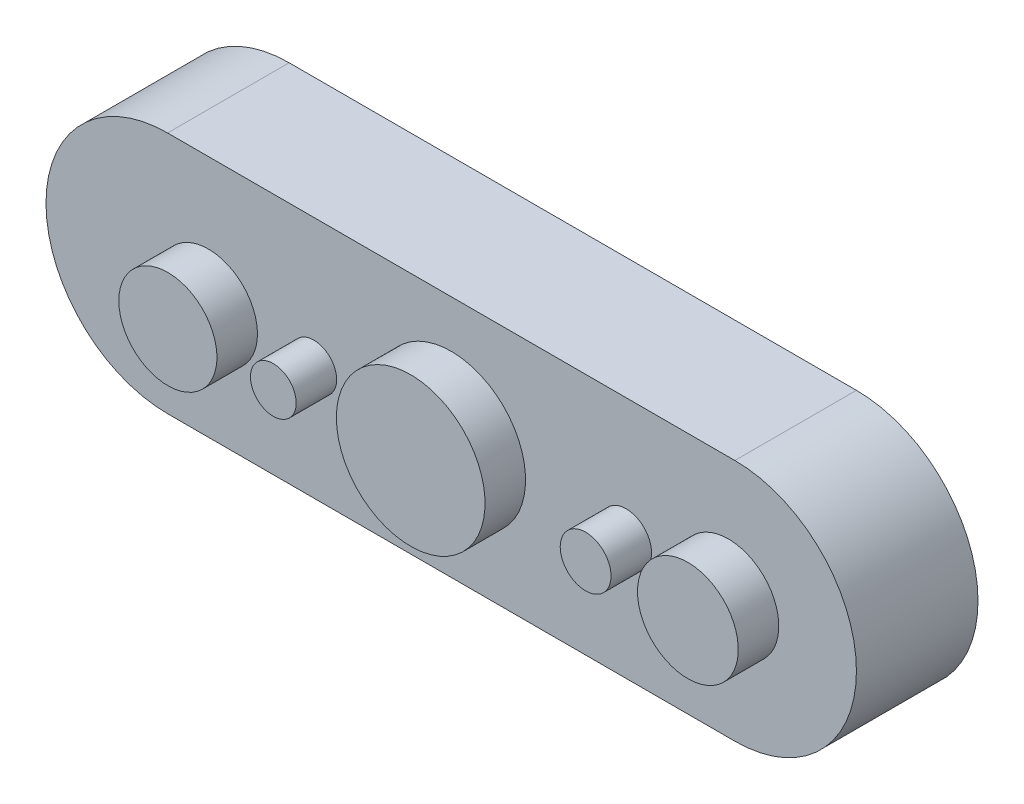
ISO-10303-21;
HEADER;
FILE_DESCRIPTION(('STEP AP214'),'2;1');
FILE_NAME('part.step','',(''),(''),'','','');
FILE_SCHEMA(('AUTOMOTIVE_DESIGN { 1 0 10303 214 1 1 1 1 }'));
ENDSEC;
DATA;
#1=APPLICATION_CONTEXT('core data for automotive mechanical design processes');
#2=APPLICATION_PROTOCOL_DEFINITION('international standard','automotive_design',2000,#1);
#3=PRODUCT_CONTEXT('',#1,'mechanical');
#4=PRODUCT('Part','Part','',(#3));
#5=PRODUCT_RELATED_PRODUCT_CATEGORY('part','',(#4));
#6=PRODUCT_DEFINITION_FORMATION('','',#4);
#7=PRODUCT_DEFINITION_CONTEXT('part definition',#1,'design');
#8=PRODUCT_DEFINITION('design','',#6,#7);
#9=PRODUCT_DEFINITION_SHAPE('','',#8);
#10=(LENGTH_UNIT() NAMED_UNIT(*) SI_UNIT(.MILLI.,.METRE.));
#11=(NAMED_UNIT(*) PLANE_ANGLE_UNIT() SI_UNIT($,.RADIAN.));
#12=(NAMED_UNIT(*) SI_UNIT($,.STERADIAN.) SOLID_ANGLE_UNIT());
#13=UNCERTAINTY_MEASURE_WITH_UNIT(LENGTH_MEASURE(1.E-05),#10,'distance_accuracy_value','');
#14=(GEOMETRIC_REPRESENTATION_CONTEXT(3) GLOBAL_UNCERTAINTY_ASSIGNED_CONTEXT((#13)) GLOBAL_UNIT_ASSIGNED_CONTEXT((#10,
#11,#12)) REPRESENTATION_CONTEXT('',''));
#15=CARTESIAN_POINT('',(0.,0.,0.));
#16=DIRECTION('',(0.,0.,1.));
#17=DIRECTION('',(1.,0.,0.));
#18=AXIS2_PLACEMENT_3D('',#15,#16,#17);
#19=CARTESIAN_POINT('',(-3.5,0.,1.5));
#20=DIRECTION('',(0.,0.,-1.));
#21=DIRECTION('',(-1.,0.,0.));
#22=AXIS2_PLACEMENT_3D('',#19,#20,#21);
#23=CYLINDRICAL_SURFACE('',#22,1.5);
#24=CARTESIAN_POINT('',(-3.5,0.,0.));
#25=DIRECTION('',(0.,0.,-1.));
#26=DIRECTION('',(-1.,0.,0.));
#27=AXIS2_PLACEMENT_3D('',#24,#25,#26);
#28=CIRCLE('',#27,1.5);
#29=CARTESIAN_POINT('',(-3.5,-1.5,0.));
#30=VERTEX_POINT('',#29);
#31=CARTESIAN_POINT('',(-3.5,1.5,0.));
#32=VERTEX_POINT('',#31);
#33=EDGE_CURVE('E101',#30,#32,#28,.T.);
#34=ORIENTED_EDGE('',*,*,#33,.F.);
#35=DIRECTION('',(0.,0.,-1.));
#36=VECTOR('',#35,1.);
#37=CARTESIAN_POINT('',(-3.5,-1.5,1.5));
#38=LINE('',#37,#36);
#39=CARTESIAN_POINT('',(-3.5,-1.5,1.5));
#40=VERTEX_POINT('',#39);
#41=EDGE_CURVE('E11',#40,#30,#38,.T.);
#42=ORIENTED_EDGE('',*,*,#41,.F.);
#43=CARTESIAN_POINT('',(-3.5,0.,1.5));
#44=DIRECTION('',(0.,0.,-1.));
#45=DIRECTION('',(-1.,0.,0.));
#46=AXIS2_PLACEMENT_3D('',#43,#44,#45);
#47=CIRCLE('',#46,1.5);
#48=CARTESIAN_POINT('',(-3.5,1.5,1.5));
#49=VERTEX_POINT('',#48);
#50=EDGE_CURVE('E94',#40,#49,#47,.T.);
#51=ORIENTED_EDGE('',*,*,#50,.T.);
#52=DIRECTION('',(0.,0.,-1.));
#53=VECTOR('',#52,1.);
#54=CARTESIAN_POINT('',(-3.5,1.5,1.5));
#55=LINE('',#54,#53);
#56=EDGE_CURVE('E39',#49,#32,#55,.T.);
#57=ORIENTED_EDGE('',*,*,#56,.T.);
#58=EDGE_LOOP('',(#34,#42,#51,#57));
#59=FACE_BOUND('',#58,.T.);
#60=ADVANCED_FACE('F36',(#59),#23,.T.);
#61=CARTESIAN_POINT('',(3.5,-1.5,1.5));
#62=DIRECTION('',(0.,-1.,0.));
#63=DIRECTION('',(0.,0.,-1.));
#64=AXIS2_PLACEMENT_3D('',#61,#62,#63);
#65=PLANE('',#64);
#66=DIRECTION('',(-1.,0.,0.));
#67=VECTOR('',#66,1.);
#68=CARTESIAN_POINT('',(3.5,-1.5,0.));
#69=LINE('',#68,#67);
#70=CARTESIAN_POINT('',(3.5,-1.5,0.));
#71=VERTEX_POINT('',#70);
#72=EDGE_CURVE('E96',#71,#30,#69,.T.);
#73=ORIENTED_EDGE('',*,*,#72,.F.);
#74=DIRECTION('',(0.,0.,-1.));
#75=VECTOR('',#74,1.);
#76=CARTESIAN_POINT('',(3.5,-1.5,1.5));
#77=LINE('',#76,#75);
#78=CARTESIAN_POINT('',(3.5,-1.5,1.5));
#79=VERTEX_POINT('',#78);
#80=EDGE_CURVE('E45',#79,#71,#77,.T.);
#81=ORIENTED_EDGE('',*,*,#80,.F.);
#82=DIRECTION('',(-1.,0.,0.));
#83=VECTOR('',#82,1.);
#84=CARTESIAN_POINT('',(3.5,-1.5,1.5));
#85=LINE('',#84,#83);
#86=EDGE_CURVE('E91',#79,#40,#85,.T.);
#87=ORIENTED_EDGE('',*,*,#86,.T.);
#88=ORIENTED_EDGE('',*,*,#41,.T.);
#89=EDGE_LOOP('',(#73,#81,#87,#88));
#90=FACE_BOUND('',#89,.T.);
#91=ADVANCED_FACE('F112',(#90),#65,.T.);
#92=CARTESIAN_POINT('',(3.5,0.,1.5));
#93=DIRECTION('',(0.,0.,-1.));
#94=DIRECTION('',(-1.,0.,0.));
#95=AXIS2_PLACEMENT_3D('',#92,#93,#94);
#96=CYLINDRICAL_SURFACE('',#95,1.5);
#97=CARTESIAN_POINT('',(3.5,0.,0.));
#98=DIRECTION('',(0.,0.,-1.));
#99=DIRECTION('',(-1.,0.,0.));
#100=AXIS2_PLACEMENT_3D('',#97,#98,#99);
#101=CIRCLE('',#100,1.5);
#102=CARTESIAN_POINT('',(3.5,1.5,0.));
#103=VERTEX_POINT('',#102);
#104=EDGE_CURVE('E86',#103,#71,#101,.T.);
#105=ORIENTED_EDGE('',*,*,#104,.F.);
#106=DIRECTION('',(0.,0.,-1.));
#107=VECTOR('',#106,1.);
#108=CARTESIAN_POINT('',(3.5,1.5,1.5));
#109=LINE('',#108,#107);
#110=CARTESIAN_POINT('',(3.5,1.5,1.5));
#111=VERTEX_POINT('',#110);
#112=EDGE_CURVE('E81',#111,#103,#109,.T.);
#113=ORIENTED_EDGE('',*,*,#112,.F.);
#114=CARTESIAN_POINT('',(3.5,0.,1.5));
#115=DIRECTION('',(0.,0.,-1.));
#116=DIRECTION('',(-1.,0.,0.));
#117=AXIS2_PLACEMENT_3D('',#114,#115,#116);
#118=CIRCLE('',#117,1.5);
#119=EDGE_CURVE('E84',#111,#79,#118,.T.);
#120=ORIENTED_EDGE('',*,*,#119,.T.);
#121=ORIENTED_EDGE('',*,*,#80,.T.);
#122=EDGE_LOOP('',(#105,#113,#120,#121));
#123=FACE_BOUND('',#122,.T.);
#124=ADVANCED_FACE('F83',(#123),#96,.T.);
#125=CARTESIAN_POINT('',(-3.5,1.5,1.5));
#126=DIRECTION('',(0.,1.,0.));
#127=DIRECTION('',(0.,0.,1.));
#128=AXIS2_PLACEMENT_3D('',#125,#126,#127);
#129=PLANE('',#128);
#130=DIRECTION('',(1.,0.,0.));
#131=VECTOR('',#130,1.);
#132=CARTESIAN_POINT('',(-3.5,1.5,0.));
#133=LINE('',#132,#131);
#134=EDGE_CURVE('E104',#32,#103,#133,.T.);
#135=ORIENTED_EDGE('',*,*,#134,.F.);
#136=ORIENTED_EDGE('',*,*,#56,.F.);
#137=DIRECTION('',(1.,0.,0.));
#138=VECTOR('',#137,1.);
#139=CARTESIAN_POINT('',(-3.5,1.5,1.5));
#140=LINE('',#139,#138);
#141=EDGE_CURVE('E90',#49,#111,#140,.T.);
#142=ORIENTED_EDGE('',*,*,#141,.T.);
#143=ORIENTED_EDGE('',*,*,#112,.T.);
#144=EDGE_LOOP('',(#135,#136,#142,#143));
#145=FACE_BOUND('',#144,.T.);
#146=ADVANCED_FACE('F93',(#145),#129,.T.);
#147=CARTESIAN_POINT('',(-3.5,0.,1.5));
#148=DIRECTION('',(0.,0.,-1.));
#149=DIRECTION('',(-1.,0.,0.));
#150=AXIS2_PLACEMENT_3D('',#147,#148,#149);
#151=PLANE('',#150);
#152=CARTESIAN_POINT('',(-2.99626852455027,-0.0936333913921916,1.5));
#153=DIRECTION('',(0.,0.,-1.));
#154=DIRECTION('',(-1.,0.,0.));
#155=AXIS2_PLACEMENT_3D('',#152,#153,#154);
#156=CIRCLE('',#155,0.605170603250103);
#157=CARTESIAN_POINT('',(-3.60143912780038,-0.0936333913921916,1.5));
#158=VERTEX_POINT('',#157);
#159=EDGE_CURVE('E178',#158,#158,#156,.T.);
#160=ORIENTED_EDGE('',*,*,#159,.T.);
#161=EDGE_LOOP('',(#160));
#162=FACE_BOUND('',#161,.T.);
#163=CARTESIAN_POINT('',(-1.69525719152187,-0.0936333913921916,1.5));
#164=DIRECTION('',(0.,0.,-1.));
#165=DIRECTION('',(-1.,0.,0.));
#166=AXIS2_PLACEMENT_3D('',#163,#164,#165);
#167=CIRCLE('',#166,0.282237082842353);
#168=CARTESIAN_POINT('',(-1.97749427436422,-0.0936333913921916,1.5));
#169=VERTEX_POINT('',#168);
#170=EDGE_CURVE('E177',#169,#169,#167,.T.);
#171=ORIENTED_EDGE('',*,*,#170,.T.);
#172=EDGE_LOOP('',(#171));
#173=FACE_BOUND('',#172,.T.);
#174=CARTESIAN_POINT('',(0.,0.,1.5));
#175=DIRECTION('',(0.,0.,-1.));
#176=DIRECTION('',(-1.,0.,0.));
#177=AXIS2_PLACEMENT_3D('',#174,#175,#176);
#178=CIRCLE('',#177,0.917270519237656);
#179=CARTESIAN_POINT('',(-0.917270519237656,0.,1.5));
#180=VERTEX_POINT('',#179);
#181=EDGE_CURVE('E187',#180,#180,#178,.T.);
#182=ORIENTED_EDGE('',*,*,#181,.T.);
#183=EDGE_LOOP('',(#182));
#184=FACE_BOUND('',#183,.T.);
#185=CARTESIAN_POINT('',(2.15849607525168,0.,1.5));
#186=DIRECTION('',(0.,0.,-1.));
#187=DIRECTION('',(-1.,0.,0.));
#188=AXIS2_PLACEMENT_3D('',#185,#186,#187);
#189=CIRCLE('',#188,0.313581939004538);
#190=CARTESIAN_POINT('',(1.84491413624714,0.,1.5));
#191=VERTEX_POINT('',#190);
#192=EDGE_CURVE('E193',#191,#191,#189,.T.);
#193=ORIENTED_EDGE('',*,*,#192,.T.);
#194=EDGE_LOOP('',(#193));
#195=FACE_BOUND('',#194,.T.);
#196=CARTESIAN_POINT('',(3.42008282243074,0.,1.5));
#197=DIRECTION('',(0.,0.,-1.));
#198=DIRECTION('',(-1.,0.,0.));
#199=AXIS2_PLACEMENT_3D('',#196,#197,#198);
#200=CIRCLE('',#199,0.621894725347653);
#201=CARTESIAN_POINT('',(2.79818809708309,0.,1.5));
#202=VERTEX_POINT('',#201);
#203=EDGE_CURVE('E199',#202,#202,#200,.T.);
#204=ORIENTED_EDGE('',*,*,#203,.T.);
#205=EDGE_LOOP('',(#204));
#206=FACE_BOUND('',#205,.T.);
#207=ORIENTED_EDGE('',*,*,#50,.F.);
#208=ORIENTED_EDGE('',*,*,#86,.F.);
#209=ORIENTED_EDGE('',*,*,#119,.F.);
#210=ORIENTED_EDGE('',*,*,#141,.F.);
#211=EDGE_LOOP('',(#207,#208,#209,#210));
#212=FACE_BOUND('',#211,.T.);
#213=ADVANCED_FACE('F89',(#162,#173,#184,#195,#206,#212),#151,.F.);
#214=CARTESIAN_POINT('',(-3.5,0.,0.));
#215=DIRECTION('',(0.,0.,-1.));
#216=DIRECTION('',(-1.,0.,0.));
#217=AXIS2_PLACEMENT_3D('',#214,#215,#216);
#218=PLANE('',#217);
#219=ORIENTED_EDGE('',*,*,#33,.T.);
#220=ORIENTED_EDGE('',*,*,#134,.T.);
#221=ORIENTED_EDGE('',*,*,#104,.T.);
#222=ORIENTED_EDGE('',*,*,#72,.T.);
#223=EDGE_LOOP('',(#219,#220,#221,#222));
#224=FACE_BOUND('',#223,.T.);
#225=ADVANCED_FACE('F111',(#224),#218,.T.);
#226=CARTESIAN_POINT('',(3.42008282243074,0.,2.));
#227=DIRECTION('',(0.,0.,-1.));
#228=DIRECTION('',(-1.,0.,0.));
#229=AXIS2_PLACEMENT_3D('',#226,#227,#228);
#230=CYLINDRICAL_SURFACE('',#229,0.621894725347653);
#231=CARTESIAN_POINT('',(3.42008282243074,0.,2.));
#232=DIRECTION('',(0.,0.,-1.));
#233=DIRECTION('',(-1.,0.,0.));
#234=AXIS2_PLACEMENT_3D('',#231,#232,#233);
#235=CIRCLE('',#234,0.621894725347652);
#236=CARTESIAN_POINT('',(2.79818809708309,0.,2.));
#237=VERTEX_POINT('',#236);
#238=EDGE_CURVE('E105',#237,#237,#235,.T.);
#239=ORIENTED_EDGE('',*,*,#238,.T.);
#240=EDGE_LOOP('',(#239));
#241=FACE_BOUND('',#240,.T.);
#242=ORIENTED_EDGE('',*,*,#203,.F.);
#243=EDGE_LOOP('',(#242));
#244=FACE_BOUND('',#243,.T.);
#245=ADVANCED_FACE('F130',(#241,#244),#230,.T.);
#246=CARTESIAN_POINT('',(4.0419775477784,0.,2.));
#247=DIRECTION('',(0.,0.,1.));
#248=DIRECTION('',(1.,0.,0.));
#249=AXIS2_PLACEMENT_3D('',#246,#247,#248);
#250=PLANE('',#249);
#251=ORIENTED_EDGE('',*,*,#238,.F.);
#252=EDGE_LOOP('',(#251));
#253=FACE_BOUND('',#252,.T.);
#254=ADVANCED_FACE('F136',(#253),#250,.T.);
#255=CARTESIAN_POINT('',(2.15849607525168,0.,2.));
#256=DIRECTION('',(0.,0.,-1.));
#257=DIRECTION('',(-1.,0.,0.));
#258=AXIS2_PLACEMENT_3D('',#255,#256,#257);
#259=CYLINDRICAL_SURFACE('',#258,0.313581939004537);
#260=CARTESIAN_POINT('',(2.15849607525168,0.,2.));
#261=DIRECTION('',(0.,0.,-1.));
#262=DIRECTION('',(-1.,0.,0.));
#263=AXIS2_PLACEMENT_3D('',#260,#261,#262);
#264=CIRCLE('',#263,0.313581939004537);
#265=CARTESIAN_POINT('',(1.84491413624714,0.,2.));
#266=VERTEX_POINT('',#265);
#267=EDGE_CURVE('E196',#266,#266,#264,.T.);
#268=ORIENTED_EDGE('',*,*,#267,.T.);
#269=EDGE_LOOP('',(#268));
#270=FACE_BOUND('',#269,.T.);
#271=ORIENTED_EDGE('',*,*,#192,.F.);
#272=EDGE_LOOP('',(#271));
#273=FACE_BOUND('',#272,.T.);
#274=ADVANCED_FACE('F140',(#270,#273),#259,.T.);
#275=CARTESIAN_POINT('',(2.47207801425622,0.,2.));
#276=DIRECTION('',(0.,0.,1.));
#277=DIRECTION('',(1.,0.,0.));
#278=AXIS2_PLACEMENT_3D('',#275,#276,#277);
#279=PLANE('',#278);
#280=ORIENTED_EDGE('',*,*,#267,.F.);
#281=EDGE_LOOP('',(#280));
#282=FACE_BOUND('',#281,.T.);
#283=ADVANCED_FACE('F144',(#282),#279,.T.);
#284=CARTESIAN_POINT('',(0.,0.,2.));
#285=DIRECTION('',(0.,0.,-1.));
#286=DIRECTION('',(-1.,0.,0.));
#287=AXIS2_PLACEMENT_3D('',#284,#285,#286);
#288=CYLINDRICAL_SURFACE('',#287,0.917270519237656);
#289=CARTESIAN_POINT('',(0.,0.,2.));
#290=DIRECTION('',(0.,0.,-1.));
#291=DIRECTION('',(-1.,0.,0.));
#292=AXIS2_PLACEMENT_3D('',#289,#290,#291);
#293=CIRCLE('',#292,0.917270519237656);
#294=CARTESIAN_POINT('',(-0.917270519237656,0.,2.));
#295=VERTEX_POINT('',#294);
#296=EDGE_CURVE('E190',#295,#295,#293,.T.);
#297=ORIENTED_EDGE('',*,*,#296,.T.);
#298=EDGE_LOOP('',(#297));
#299=FACE_BOUND('',#298,.T.);
#300=ORIENTED_EDGE('',*,*,#181,.F.);
#301=EDGE_LOOP('',(#300));
#302=FACE_BOUND('',#301,.T.);
#303=ADVANCED_FACE('F148',(#299,#302),#288,.T.);
#304=CARTESIAN_POINT('',(0.917270519237656,0.,2.));
#305=DIRECTION('',(0.,0.,1.));
#306=DIRECTION('',(1.,0.,0.));
#307=AXIS2_PLACEMENT_3D('',#304,#305,#306);
#308=PLANE('',#307);
#309=ORIENTED_EDGE('',*,*,#296,.F.);
#310=EDGE_LOOP('',(#309));
#311=FACE_BOUND('',#310,.T.);
#312=ADVANCED_FACE('F152',(#311),#308,.T.);
#313=CARTESIAN_POINT('',(-1.69525719152187,-0.0936333913921916,2.));
#314=DIRECTION('',(0.,0.,-1.));
#315=DIRECTION('',(-1.,0.,0.));
#316=AXIS2_PLACEMENT_3D('',#313,#314,#315);
#317=CYLINDRICAL_SURFACE('',#316,0.282237082842354);
#318=CARTESIAN_POINT('',(-1.69525719152187,-0.0936333913921916,2.));
#319=DIRECTION('',(0.,0.,-1.));
#320=DIRECTION('',(-1.,0.,0.));
#321=AXIS2_PLACEMENT_3D('',#318,#319,#320);
#322=CIRCLE('',#321,0.282237082842354);
#323=CARTESIAN_POINT('',(-1.97749427436422,-0.0936333913921916,2.));
#324=VERTEX_POINT('',#323);
#325=EDGE_CURVE('E181',#324,#324,#322,.T.);
#326=ORIENTED_EDGE('',*,*,#325,.T.);
#327=EDGE_LOOP('',(#326));
#328=FACE_BOUND('',#327,.T.);
#329=ORIENTED_EDGE('',*,*,#170,.F.);
#330=EDGE_LOOP('',(#329));
#331=FACE_BOUND('',#330,.T.);
#332=ADVANCED_FACE('F156',(#328,#331),#317,.T.);
#333=CARTESIAN_POINT('',(-1.41302010867951,-0.0936333913921916,2.));
#334=DIRECTION('',(0.,0.,1.));
#335=DIRECTION('',(1.,0.,0.));
#336=AXIS2_PLACEMENT_3D('',#333,#334,#335);
#337=PLANE('',#336);
#338=ORIENTED_EDGE('',*,*,#325,.F.);
#339=EDGE_LOOP('',(#338));
#340=FACE_BOUND('',#339,.T.);
#341=ADVANCED_FACE('F160',(#340),#337,.T.);
#342=CARTESIAN_POINT('',(-2.99626852455027,-0.0936333913921916,2.));
#343=DIRECTION('',(0.,0.,-1.));
#344=DIRECTION('',(-1.,0.,0.));
#345=AXIS2_PLACEMENT_3D('',#342,#343,#344);
#346=CYLINDRICAL_SURFACE('',#345,0.605170603250102);
#347=CARTESIAN_POINT('',(-2.99626852455027,-0.0936333913921916,2.));
#348=DIRECTION('',(0.,0.,-1.));
#349=DIRECTION('',(-1.,0.,0.));
#350=AXIS2_PLACEMENT_3D('',#347,#348,#349);
#351=CIRCLE('',#350,0.605170603250102);
#352=CARTESIAN_POINT('',(-3.60143912780038,-0.0936333913921916,2.));
#353=VERTEX_POINT('',#352);
#354=EDGE_CURVE('E176',#353,#353,#351,.T.);
#355=ORIENTED_EDGE('',*,*,#354,.T.);
#356=EDGE_LOOP('',(#355));
#357=FACE_BOUND('',#356,.T.);
#358=ORIENTED_EDGE('',*,*,#159,.F.);
#359=EDGE_LOOP('',(#358));
#360=FACE_BOUND('',#359,.T.);
#361=ADVANCED_FACE('F164',(#357,#360),#346,.T.);
#362=CARTESIAN_POINT('',(-2.39109792130017,-0.0936333913921916,2.));
#363=DIRECTION('',(0.,0.,1.));
#364=DIRECTION('',(1.,0.,0.));
#365=AXIS2_PLACEMENT_3D('',#362,#363,#364);
#366=PLANE('',#365);
#367=ORIENTED_EDGE('',*,*,#354,.F.);
#368=EDGE_LOOP('',(#367));
#369=FACE_BOUND('',#368,.T.);
#370=ADVANCED_FACE('F168',(#369),#366,.T.);
#371=CLOSED_SHELL('',(#60,#91,#124,#146,#213,#225,#245,#254,#274,#283,#303,#312,#332,#341,#361,#370));
#372=MANIFOLD_SOLID_BREP('B2',#371);
#373=ADVANCED_BREP_SHAPE_REPRESENTATION('',(#18,#372),#14);
#374=SHAPE_DEFINITION_REPRESENTATION(#9,#373);
ENDSEC;
END-ISO-10303-21;
